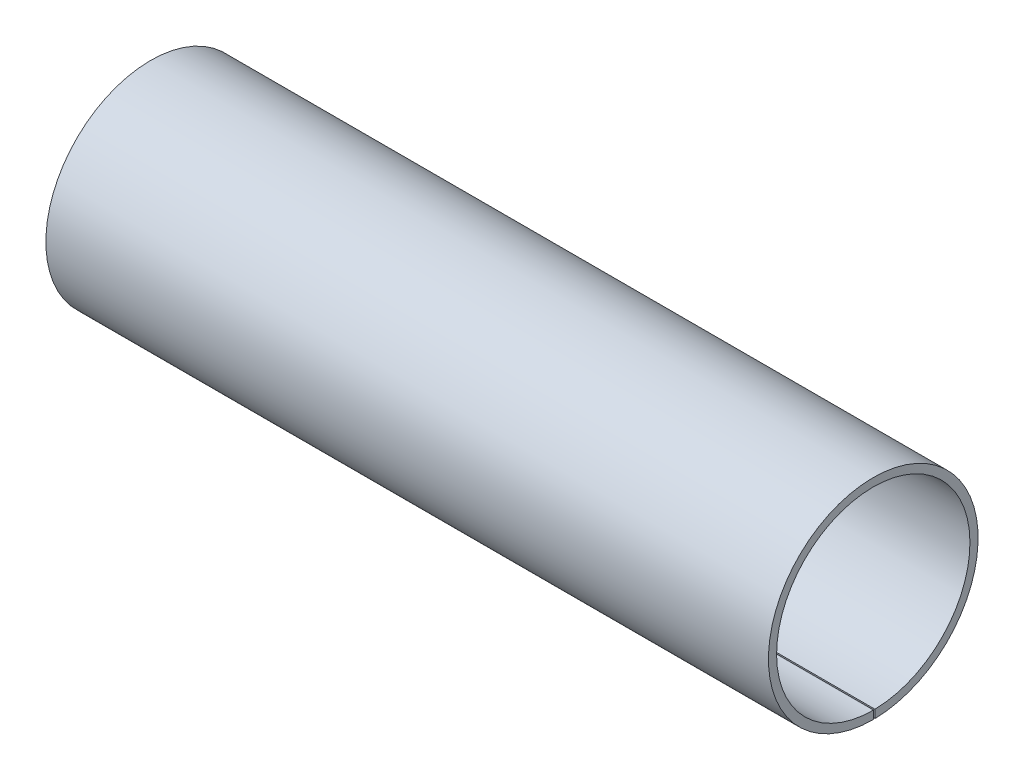
ISO-10303-21;
HEADER;
FILE_DESCRIPTION(('STEP AP214'),'2;1');
FILE_NAME('part.step','',(''),(''),'','','');
FILE_SCHEMA(('AUTOMOTIVE_DESIGN { 1 0 10303 214 1 1 1 1 }'));
ENDSEC;
DATA;
#1=APPLICATION_CONTEXT('core data for automotive mechanical design processes');
#2=APPLICATION_PROTOCOL_DEFINITION('international standard','automotive_design',2000,#1);
#3=PRODUCT_CONTEXT('',#1,'mechanical');
#4=PRODUCT('Part','Part','',(#3));
#5=PRODUCT_RELATED_PRODUCT_CATEGORY('part','',(#4));
#6=PRODUCT_DEFINITION_FORMATION('','',#4);
#7=PRODUCT_DEFINITION_CONTEXT('part definition',#1,'design');
#8=PRODUCT_DEFINITION('design','',#6,#7);
#9=PRODUCT_DEFINITION_SHAPE('','',#8);
#10=(LENGTH_UNIT() NAMED_UNIT(*) SI_UNIT(.MILLI.,.METRE.));
#11=(NAMED_UNIT(*) PLANE_ANGLE_UNIT() SI_UNIT($,.RADIAN.));
#12=(NAMED_UNIT(*) SI_UNIT($,.STERADIAN.) SOLID_ANGLE_UNIT());
#13=UNCERTAINTY_MEASURE_WITH_UNIT(LENGTH_MEASURE(1.E-05),#10,'distance_accuracy_value','');
#14=(GEOMETRIC_REPRESENTATION_CONTEXT(3) GLOBAL_UNCERTAINTY_ASSIGNED_CONTEXT((#13)) GLOBAL_UNIT_ASSIGNED_CONTEXT((#10,
#11,#12)) REPRESENTATION_CONTEXT('',''));
#15=CARTESIAN_POINT('',(0.,0.,0.));
#16=DIRECTION('',(0.,0.,1.));
#17=DIRECTION('',(1.,0.,0.));
#18=AXIS2_PLACEMENT_3D('',#15,#16,#17);
#19=CARTESIAN_POINT('',(175.5,115.75,-118.000000000001));
#20=DIRECTION('',(-1.,0.,-2.77555756156281E-13));
#21=DIRECTION('',(2.77555756156281E-13,0.,-1.));
#22=AXIS2_PLACEMENT_3D('',#19,#20,#21);
#23=PLANE('',#22);
#24=DIRECTION('',(0.,1.,0.));
#25=VECTOR('',#24,1.);
#26=CARTESIAN_POINT('',(175.5,115.75,-118.000000000001));
#27=LINE('',#26,#25);
#28=CARTESIAN_POINT('',(175.5,113.75,-118.000000000001));
#29=VERTEX_POINT('',#28);
#30=CARTESIAN_POINT('',(175.5,115.75,-118.000000000001));
#31=VERTEX_POINT('',#30);
#32=EDGE_CURVE('E14',#29,#31,#27,.T.);
#33=ORIENTED_EDGE('',*,*,#32,.F.);
#34=DIRECTION('',(0.,0.,-1.));
#35=VECTOR('',#34,1.);
#36=CARTESIAN_POINT('',(175.5,113.75,0.));
#37=LINE('',#36,#35);
#38=CARTESIAN_POINT('',(175.5,113.75,-118.100000000001));
#39=VERTEX_POINT('',#38);
#40=EDGE_CURVE('E237',#29,#39,#37,.T.);
#41=ORIENTED_EDGE('',*,*,#40,.T.);
#42=DIRECTION('',(0.,1.,0.));
#43=VECTOR('',#42,1.);
#44=CARTESIAN_POINT('',(175.5,115.75,-118.100000000001));
#45=LINE('',#44,#43);
#46=CARTESIAN_POINT('',(175.5,115.75,-118.100000000001));
#47=VERTEX_POINT('',#46);
#48=EDGE_CURVE('E144',#39,#47,#45,.T.);
#49=ORIENTED_EDGE('',*,*,#48,.T.);
#50=DIRECTION('',(2.77555756156281E-13,0.,-1.));
#51=VECTOR('',#50,1.);
#52=CARTESIAN_POINT('',(175.5,115.75,-118.000000000001));
#53=LINE('',#52,#51);
#54=EDGE_CURVE('E228',#31,#47,#53,.T.);
#55=ORIENTED_EDGE('',*,*,#54,.F.);
#56=EDGE_LOOP('',(#33,#41,#49,#55));
#57=FACE_BOUND('',#56,.T.);
#58=ADVANCED_FACE('F135',(#57),#23,.F.);
#59=CARTESIAN_POINT('',(-2.00000000000083,115.75,-118.100000000001));
#60=DIRECTION('',(0.,0.,1.));
#61=DIRECTION('',(-1.,0.,0.));
#62=AXIS2_PLACEMENT_3D('',#59,#60,#61);
#63=PLANE('',#62);
#64=ORIENTED_EDGE('',*,*,#48,.F.);
#65=DIRECTION('',(1.,0.,0.));
#66=VECTOR('',#65,1.);
#67=CARTESIAN_POINT('',(0.,113.75,-118.100000000001));
#68=LINE('',#67,#66);
#69=CARTESIAN_POINT('',(-2.00000000000083,113.75,-118.100000000001));
#70=VERTEX_POINT('',#69);
#71=EDGE_CURVE('E226',#39,#70,#68,.F.);
#72=ORIENTED_EDGE('',*,*,#71,.T.);
#73=DIRECTION('',(0.,1.,0.));
#74=VECTOR('',#73,1.);
#75=CARTESIAN_POINT('',(-2.00000000000083,115.75,-118.100000000001));
#76=LINE('',#75,#74);
#77=CARTESIAN_POINT('',(-2.00000000000083,115.75,-118.100000000001));
#78=VERTEX_POINT('',#77);
#79=EDGE_CURVE('E152',#70,#78,#76,.T.);
#80=ORIENTED_EDGE('',*,*,#79,.T.);
#81=DIRECTION('',(-1.,0.,0.));
#82=VECTOR('',#81,1.);
#83=CARTESIAN_POINT('',(-2.00000000000083,115.75,-118.100000000001));
#84=LINE('',#83,#82);
#85=EDGE_CURVE('E231',#47,#78,#84,.T.);
#86=ORIENTED_EDGE('',*,*,#85,.F.);
#87=EDGE_LOOP('',(#64,#72,#80,#86));
#88=FACE_BOUND('',#87,.T.);
#89=ADVANCED_FACE('F247',(#88),#63,.F.);
#90=CARTESIAN_POINT('',(-2.00000000000083,115.75,-118.000000000001));
#91=DIRECTION('',(1.,0.,0.));
#92=DIRECTION('',(0.,0.,1.));
#93=AXIS2_PLACEMENT_3D('',#90,#91,#92);
#94=PLANE('',#93);
#95=ORIENTED_EDGE('',*,*,#79,.F.);
#96=DIRECTION('',(0.,0.,-1.));
#97=VECTOR('',#96,1.);
#98=CARTESIAN_POINT('',(-2.00000000000083,113.75,0.));
#99=LINE('',#98,#97);
#100=CARTESIAN_POINT('',(-2.00000000000085,113.75,-118.000000000001));
#101=VERTEX_POINT('',#100);
#102=EDGE_CURVE('E203',#70,#101,#99,.F.);
#103=ORIENTED_EDGE('',*,*,#102,.T.);
#104=DIRECTION('',(0.,1.,0.));
#105=VECTOR('',#104,1.);
#106=CARTESIAN_POINT('',(-2.00000000000083,115.75,-118.000000000001));
#107=LINE('',#106,#105);
#108=CARTESIAN_POINT('',(-2.00000000000083,115.75,-118.000000000001));
#109=VERTEX_POINT('',#108);
#110=EDGE_CURVE('E138',#101,#109,#107,.T.);
#111=ORIENTED_EDGE('',*,*,#110,.T.);
#112=DIRECTION('',(0.,0.,1.));
#113=VECTOR('',#112,1.);
#114=CARTESIAN_POINT('',(-2.00000000000083,115.75,-118.000000000001));
#115=LINE('',#114,#113);
#116=EDGE_CURVE('E222',#78,#109,#115,.T.);
#117=ORIENTED_EDGE('',*,*,#116,.F.);
#118=EDGE_LOOP('',(#95,#103,#111,#117));
#119=FACE_BOUND('',#118,.T.);
#120=ADVANCED_FACE('F249',(#119),#94,.F.);
#121=CARTESIAN_POINT('',(0.,115.75,0.));
#122=DIRECTION('',(0.,-1.,0.));
#123=DIRECTION('',(0.,0.,-1.));
#124=AXIS2_PLACEMENT_3D('',#121,#122,#123);
#125=PLANE('',#124);
#126=ORIENTED_EDGE('',*,*,#116,.T.);
#127=DIRECTION('',(1.,0.,0.));
#128=VECTOR('',#127,1.);
#129=CARTESIAN_POINT('',(-2.00000000000083,115.75,-118.000000000001));
#130=LINE('',#129,#128);
#131=EDGE_CURVE('E225',#109,#31,#130,.T.);
#132=ORIENTED_EDGE('',*,*,#131,.T.);
#133=ORIENTED_EDGE('',*,*,#54,.T.);
#134=ORIENTED_EDGE('',*,*,#85,.T.);
#135=EDGE_LOOP('',(#126,#132,#133,#134));
#136=FACE_BOUND('',#135,.T.);
#137=ADVANCED_FACE('F246',(#136),#125,.F.);
#138=CARTESIAN_POINT('',(0.,113.75,0.));
#139=DIRECTION('',(0.,-1.,0.));
#140=DIRECTION('',(0.,0.,-1.));
#141=AXIS2_PLACEMENT_3D('',#138,#139,#140);
#142=PLANE('',#141);
#143=ORIENTED_EDGE('',*,*,#102,.F.);
#144=ORIENTED_EDGE('',*,*,#71,.F.);
#145=ORIENTED_EDGE('',*,*,#40,.F.);
#146=DIRECTION('',(1.,0.,0.));
#147=VECTOR('',#146,1.);
#148=CARTESIAN_POINT('',(0.,113.75,-118.000000000001));
#149=LINE('',#148,#147);
#150=EDGE_CURVE('E235',#101,#29,#149,.T.);
#151=ORIENTED_EDGE('',*,*,#150,.F.);
#152=EDGE_LOOP('',(#143,#144,#145,#151));
#153=FACE_BOUND('',#152,.T.);
#154=ADVANCED_FACE('F256',(#153),#142,.T.);
#155=CARTESIAN_POINT('',(86.7499999999996,115.753617240036,-118.414494652886));
#156=DIRECTION('',(0.,0.0174524064372692,-0.999847695156391));
#157=DIRECTION('',(1.,0.,0.));
#158=AXIS2_PLACEMENT_3D('',#155,#156,#157);
#159=PLANE('',#158);
#160=DIRECTION('',(0.,-0.999847695156391,-0.0174524064372692));
#161=VECTOR('',#160,1.);
#162=CARTESIAN_POINT('',(175.5,115.753617240036,-118.414494652886));
#163=LINE('',#162,#161);
#164=CARTESIAN_POINT('',(175.5,115.753617240036,-118.414494652886));
#165=VERTEX_POINT('',#164);
#166=CARTESIAN_POINT('',(175.5,113.753921849723,-118.449399465761));
#167=VERTEX_POINT('',#166);
#168=EDGE_CURVE('E192',#165,#167,#163,.T.);
#169=ORIENTED_EDGE('',*,*,#168,.F.);
#170=DIRECTION('',(1.,0.,0.));
#171=VECTOR('',#170,1.);
#172=CARTESIAN_POINT('',(175.5,115.753617240036,-118.414494652886));
#173=LINE('',#172,#171);
#174=CARTESIAN_POINT('',(-2.00000000000083,115.753617240036,-118.414494652886));
#175=VERTEX_POINT('',#174);
#176=EDGE_CURVE('E195',#175,#165,#173,.T.);
#177=ORIENTED_EDGE('',*,*,#176,.F.);
#178=DIRECTION('',(0.,-0.999847695156391,-0.0174524064372692));
#179=VECTOR('',#178,1.);
#180=CARTESIAN_POINT('',(-2.00000000000083,115.753617240036,-118.414494652886));
#181=LINE('',#180,#179);
#182=CARTESIAN_POINT('',(-2.00000000000085,113.753921849723,-118.449399465761));
#183=VERTEX_POINT('',#182);
#184=EDGE_CURVE('E204',#175,#183,#181,.T.);
#185=ORIENTED_EDGE('',*,*,#184,.T.);
#186=DIRECTION('',(1.,0.,0.));
#187=VECTOR('',#186,1.);
#188=CARTESIAN_POINT('',(175.5,113.753921849723,-118.449399465761));
#189=LINE('',#188,#187);
#190=EDGE_CURVE('E198',#183,#167,#189,.T.);
#191=ORIENTED_EDGE('',*,*,#190,.T.);
#192=EDGE_LOOP('',(#169,#177,#185,#191));
#193=FACE_BOUND('',#192,.T.);
#194=ADVANCED_FACE('F194',(#193),#159,.F.);
#195=CARTESIAN_POINT('',(-2.00000000000083,139.5,-118.000000000001));
#196=DIRECTION('',(-1.,0.,0.));
#197=DIRECTION('',(0.,-1.,0.));
#198=AXIS2_PLACEMENT_3D('',#195,#196,#197);
#199=PLANE('',#198);
#200=ORIENTED_EDGE('',*,*,#184,.F.);
#201=CARTESIAN_POINT('',(-2.00000000000083,139.5,-118.000000000001));
#202=DIRECTION('',(1.,0.,0.));
#203=DIRECTION('',(0.,1.,0.));
#204=AXIS2_PLACEMENT_3D('',#201,#202,#203);
#205=CIRCLE('',#204,23.7500000000003);
#206=EDGE_CURVE('E212',#109,#175,#205,.F.);
#207=ORIENTED_EDGE('',*,*,#206,.F.);
#208=ORIENTED_EDGE('',*,*,#110,.F.);
#209=CARTESIAN_POINT('',(-2.00000000000083,139.5,-118.000000000001));
#210=DIRECTION('',(1.,0.,0.));
#211=DIRECTION('',(0.,1.,0.));
#212=AXIS2_PLACEMENT_3D('',#209,#210,#211);
#213=CIRCLE('',#212,25.7500000000003);
#214=EDGE_CURVE('E220',#101,#183,#213,.F.);
#215=ORIENTED_EDGE('',*,*,#214,.T.);
#216=EDGE_LOOP('',(#200,#207,#208,#215));
#217=FACE_BOUND('',#216,.T.);
#218=ADVANCED_FACE('F265',(#217),#199,.T.);
#219=CARTESIAN_POINT('',(175.5,139.5,-118.000000000001));
#220=DIRECTION('',(-1.,0.,0.));
#221=DIRECTION('',(0.,-1.,0.));
#222=AXIS2_PLACEMENT_3D('',#219,#220,#221);
#223=PLANE('',#222);
#224=CARTESIAN_POINT('',(175.5,139.5,-118.000000000001));
#225=DIRECTION('',(1.,0.,0.));
#226=DIRECTION('',(0.,1.,0.));
#227=AXIS2_PLACEMENT_3D('',#224,#225,#226);
#228=CIRCLE('',#227,23.7500000000003);
#229=EDGE_CURVE('E210',#165,#31,#228,.T.);
#230=ORIENTED_EDGE('',*,*,#229,.F.);
#231=ORIENTED_EDGE('',*,*,#168,.T.);
#232=CARTESIAN_POINT('',(175.5,139.5,-118.000000000001));
#233=DIRECTION('',(1.,0.,0.));
#234=DIRECTION('',(0.,1.,0.));
#235=AXIS2_PLACEMENT_3D('',#232,#233,#234);
#236=CIRCLE('',#235,25.7500000000003);
#237=EDGE_CURVE('E277',#167,#29,#236,.T.);
#238=ORIENTED_EDGE('',*,*,#237,.T.);
#239=ORIENTED_EDGE('',*,*,#32,.T.);
#240=EDGE_LOOP('',(#230,#231,#238,#239));
#241=FACE_BOUND('',#240,.T.);
#242=ADVANCED_FACE('F214',(#241),#223,.F.);
#243=CARTESIAN_POINT('',(175.5,139.5,-118.000000000001));
#244=DIRECTION('',(1.,0.,0.));
#245=DIRECTION('',(0.,-0.999847695156391,-0.0174524064372693));
#246=AXIS2_PLACEMENT_3D('',#243,#244,#245);
#247=CYLINDRICAL_SURFACE('',#246,25.7500000000003);
#248=ORIENTED_EDGE('',*,*,#150,.T.);
#249=ORIENTED_EDGE('',*,*,#237,.F.);
#250=ORIENTED_EDGE('',*,*,#190,.F.);
#251=ORIENTED_EDGE('',*,*,#214,.F.);
#252=EDGE_LOOP('',(#248,#249,#250,#251));
#253=FACE_BOUND('',#252,.T.);
#254=ADVANCED_FACE('F264',(#253),#247,.T.);
#255=CARTESIAN_POINT('',(175.5,139.5,-118.000000000001));
#256=DIRECTION('',(1.,0.,0.));
#257=DIRECTION('',(0.,-0.999847695156391,-0.0174524064372693));
#258=AXIS2_PLACEMENT_3D('',#255,#256,#257);
#259=CYLINDRICAL_SURFACE('',#258,23.7500000000003);
#260=ORIENTED_EDGE('',*,*,#131,.F.);
#261=ORIENTED_EDGE('',*,*,#206,.T.);
#262=ORIENTED_EDGE('',*,*,#176,.T.);
#263=ORIENTED_EDGE('',*,*,#229,.T.);
#264=EDGE_LOOP('',(#260,#261,#262,#263));
#265=FACE_BOUND('',#264,.T.);
#266=ADVANCED_FACE('F209',(#265),#259,.F.);
#267=CLOSED_SHELL('',(#58,#89,#120,#137,#154,#194,#218,#242,#254,#266));
#268=MANIFOLD_SOLID_BREP('B2',#267);
#269=ADVANCED_BREP_SHAPE_REPRESENTATION('',(#18,#268),#14);
#270=SHAPE_DEFINITION_REPRESENTATION(#9,#269);
ENDSEC;
END-ISO-10303-21;
